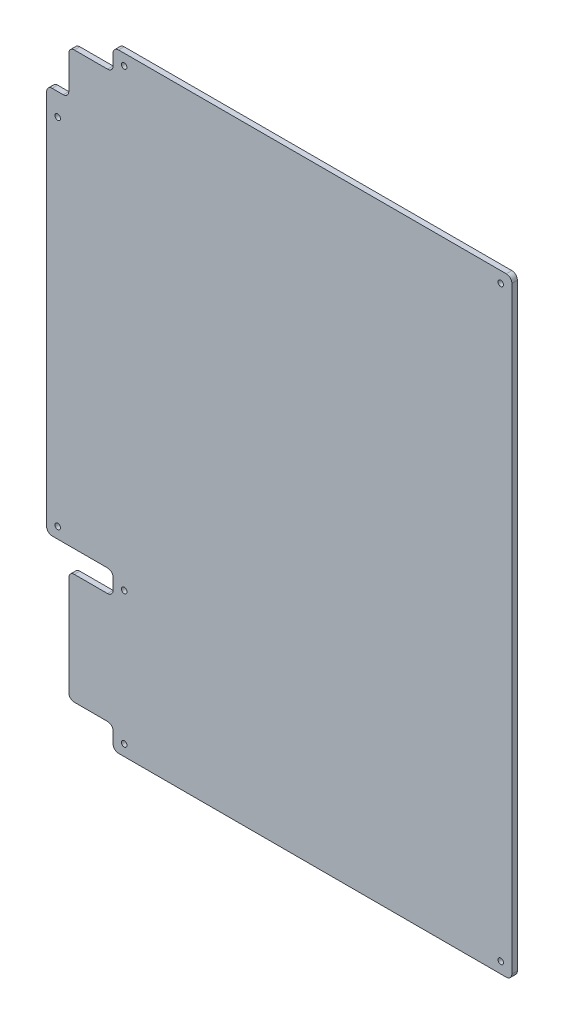
ISO-10303-21;
HEADER;
FILE_DESCRIPTION(('STEP AP214'),'2;1');
FILE_NAME('part.step','',(''),(''),'','','');
FILE_SCHEMA(('AUTOMOTIVE_DESIGN { 1 0 10303 214 1 1 1 1 }'));
ENDSEC;
DATA;
#1=APPLICATION_CONTEXT('core data for automotive mechanical design processes');
#2=APPLICATION_PROTOCOL_DEFINITION('international standard','automotive_design',2000,#1);
#3=PRODUCT_CONTEXT('',#1,'mechanical');
#4=PRODUCT('Part','Part','',(#3));
#5=PRODUCT_RELATED_PRODUCT_CATEGORY('part','',(#4));
#6=PRODUCT_DEFINITION_FORMATION('','',#4);
#7=PRODUCT_DEFINITION_CONTEXT('part definition',#1,'design');
#8=PRODUCT_DEFINITION('design','',#6,#7);
#9=PRODUCT_DEFINITION_SHAPE('','',#8);
#10=(LENGTH_UNIT() NAMED_UNIT(*) SI_UNIT(.MILLI.,.METRE.));
#11=(NAMED_UNIT(*) PLANE_ANGLE_UNIT() SI_UNIT($,.RADIAN.));
#12=(NAMED_UNIT(*) SI_UNIT($,.STERADIAN.) SOLID_ANGLE_UNIT());
#13=UNCERTAINTY_MEASURE_WITH_UNIT(LENGTH_MEASURE(1.E-05),#10,'distance_accuracy_value','');
#14=(GEOMETRIC_REPRESENTATION_CONTEXT(3) GLOBAL_UNCERTAINTY_ASSIGNED_CONTEXT((#13)) GLOBAL_UNIT_ASSIGNED_CONTEXT((#10,
#11,#12)) REPRESENTATION_CONTEXT('',''));
#15=CARTESIAN_POINT('',(0.,0.,0.));
#16=DIRECTION('',(0.,0.,1.));
#17=DIRECTION('',(1.,0.,0.));
#18=AXIS2_PLACEMENT_3D('',#15,#16,#17);
#19=CARTESIAN_POINT('',(210.,275.,5.));
#20=DIRECTION('',(-1.,0.,0.));
#21=DIRECTION('',(0.,0.,1.));
#22=AXIS2_PLACEMENT_3D('',#19,#20,#21);
#23=PLANE('',#22);
#24=DIRECTION('',(0.,1.,0.));
#25=VECTOR('',#24,1.);
#26=CARTESIAN_POINT('',(210.,275.,5.));
#27=LINE('',#26,#25);
#28=CARTESIAN_POINT('',(210.,-270.,5.));
#29=VERTEX_POINT('',#28);
#30=CARTESIAN_POINT('',(210.,270.,5.));
#31=VERTEX_POINT('',#30);
#32=EDGE_CURVE('E246',#29,#31,#27,.T.);
#33=ORIENTED_EDGE('',*,*,#32,.F.);
#34=DIRECTION('',(0.,0.,-1.));
#35=VECTOR('',#34,1.);
#36=CARTESIAN_POINT('',(210.,-270.,5.));
#37=LINE('',#36,#35);
#38=CARTESIAN_POINT('',(210.,-270.,0.));
#39=VERTEX_POINT('',#38);
#40=EDGE_CURVE('E230',#29,#39,#37,.T.);
#41=ORIENTED_EDGE('',*,*,#40,.T.);
#42=DIRECTION('',(0.,1.,0.));
#43=VECTOR('',#42,1.);
#44=CARTESIAN_POINT('',(210.,275.,0.));
#45=LINE('',#44,#43);
#46=CARTESIAN_POINT('',(210.,270.,0.));
#47=VERTEX_POINT('',#46);
#48=EDGE_CURVE('E243',#39,#47,#45,.T.);
#49=ORIENTED_EDGE('',*,*,#48,.T.);
#50=DIRECTION('',(0.,0.,-1.));
#51=VECTOR('',#50,1.);
#52=CARTESIAN_POINT('',(210.,270.,5.));
#53=LINE('',#52,#51);
#54=EDGE_CURVE('E249',#47,#31,#53,.F.);
#55=ORIENTED_EDGE('',*,*,#54,.T.);
#56=EDGE_LOOP('',(#33,#41,#49,#55));
#57=FACE_BOUND('',#56,.T.);
#58=ADVANCED_FACE('F39',(#57),#23,.F.);
#59=CARTESIAN_POINT('',(-210.,275.,5.));
#60=DIRECTION('',(0.,-1.,0.));
#61=DIRECTION('',(0.,0.,-1.));
#62=AXIS2_PLACEMENT_3D('',#59,#60,#61);
#63=PLANE('',#62);
#64=DIRECTION('',(-1.,0.,0.));
#65=VECTOR('',#64,1.);
#66=CARTESIAN_POINT('',(-210.,275.,5.));
#67=LINE('',#66,#65);
#68=CARTESIAN_POINT('',(205.,275.,5.));
#69=VERTEX_POINT('',#68);
#70=CARTESIAN_POINT('',(-145.,275.,5.));
#71=VERTEX_POINT('',#70);
#72=EDGE_CURVE('E532',#69,#71,#67,.T.);
#73=ORIENTED_EDGE('',*,*,#72,.F.);
#74=DIRECTION('',(0.,0.,-1.));
#75=VECTOR('',#74,1.);
#76=CARTESIAN_POINT('',(205.,275.,5.));
#77=LINE('',#76,#75);
#78=CARTESIAN_POINT('',(205.,275.,0.));
#79=VERTEX_POINT('',#78);
#80=EDGE_CURVE('E396',#69,#79,#77,.T.);
#81=ORIENTED_EDGE('',*,*,#80,.T.);
#82=DIRECTION('',(-1.,0.,0.));
#83=VECTOR('',#82,1.);
#84=CARTESIAN_POINT('',(-210.,275.,0.));
#85=LINE('',#84,#83);
#86=CARTESIAN_POINT('',(-145.,275.,0.));
#87=VERTEX_POINT('',#86);
#88=EDGE_CURVE('E254',#79,#87,#85,.T.);
#89=ORIENTED_EDGE('',*,*,#88,.T.);
#90=DIRECTION('',(0.,0.,1.));
#91=VECTOR('',#90,1.);
#92=CARTESIAN_POINT('',(-145.,275.,5.));
#93=LINE('',#92,#91);
#94=EDGE_CURVE('E392',#87,#71,#93,.T.);
#95=ORIENTED_EDGE('',*,*,#94,.T.);
#96=EDGE_LOOP('',(#73,#81,#89,#95));
#97=FACE_BOUND('',#96,.T.);
#98=ADVANCED_FACE('F529',(#97),#63,.F.);
#99=CARTESIAN_POINT('',(-210.,275.,5.));
#100=DIRECTION('',(1.,0.,0.));
#101=DIRECTION('',(0.,0.,-1.));
#102=AXIS2_PLACEMENT_3D('',#99,#100,#101);
#103=PLANE('',#102);
#104=DIRECTION('',(0.,-1.,0.));
#105=VECTOR('',#104,1.);
#106=CARTESIAN_POINT('',(-210.,275.,0.));
#107=LINE('',#106,#105);
#108=CARTESIAN_POINT('',(-210.,210.,0.));
#109=VERTEX_POINT('',#108);
#110=CARTESIAN_POINT('',(-210.,-130.,0.));
#111=VERTEX_POINT('',#110);
#112=EDGE_CURVE('E260',#109,#111,#107,.T.);
#113=ORIENTED_EDGE('',*,*,#112,.T.);
#114=DIRECTION('',(0.,0.,1.));
#115=VECTOR('',#114,1.);
#116=CARTESIAN_POINT('',(-210.,-130.,5.));
#117=LINE('',#116,#115);
#118=CARTESIAN_POINT('',(-210.,-130.,5.));
#119=VERTEX_POINT('',#118);
#120=EDGE_CURVE('E445',#111,#119,#117,.T.);
#121=ORIENTED_EDGE('',*,*,#120,.T.);
#122=DIRECTION('',(0.,-1.,0.));
#123=VECTOR('',#122,1.);
#124=CARTESIAN_POINT('',(-210.,275.,5.));
#125=LINE('',#124,#123);
#126=CARTESIAN_POINT('',(-210.,210.,5.));
#127=VERTEX_POINT('',#126);
#128=EDGE_CURVE('E539',#127,#119,#125,.T.);
#129=ORIENTED_EDGE('',*,*,#128,.F.);
#130=DIRECTION('',(0.,0.,1.));
#131=VECTOR('',#130,1.);
#132=CARTESIAN_POINT('',(-210.,210.,5.));
#133=LINE('',#132,#131);
#134=EDGE_CURVE('E442',#127,#109,#133,.F.);
#135=ORIENTED_EDGE('',*,*,#134,.T.);
#136=EDGE_LOOP('',(#113,#121,#129,#135));
#137=FACE_BOUND('',#136,.T.);
#138=ADVANCED_FACE('F618',(#137),#103,.F.);
#139=CARTESIAN_POINT('',(-210.,-275.,5.));
#140=DIRECTION('',(0.,1.,0.));
#141=DIRECTION('',(0.,0.,1.));
#142=AXIS2_PLACEMENT_3D('',#139,#140,#141);
#143=PLANE('',#142);
#144=DIRECTION('',(1.,0.,0.));
#145=VECTOR('',#144,1.);
#146=CARTESIAN_POINT('',(-210.,-275.,0.));
#147=LINE('',#146,#145);
#148=CARTESIAN_POINT('',(-145.,-275.,0.));
#149=VERTEX_POINT('',#148);
#150=CARTESIAN_POINT('',(205.,-275.,0.));
#151=VERTEX_POINT('',#150);
#152=EDGE_CURVE('E272',#149,#151,#147,.T.);
#153=ORIENTED_EDGE('',*,*,#152,.T.);
#154=DIRECTION('',(0.,0.,-1.));
#155=VECTOR('',#154,1.);
#156=CARTESIAN_POINT('',(205.,-275.,5.));
#157=LINE('',#156,#155);
#158=CARTESIAN_POINT('',(205.,-275.,5.));
#159=VERTEX_POINT('',#158);
#160=EDGE_CURVE('E231',#151,#159,#157,.F.);
#161=ORIENTED_EDGE('',*,*,#160,.T.);
#162=DIRECTION('',(1.,0.,0.));
#163=VECTOR('',#162,1.);
#164=CARTESIAN_POINT('',(-210.,-275.,5.));
#165=LINE('',#164,#163);
#166=CARTESIAN_POINT('',(-145.,-275.,5.));
#167=VERTEX_POINT('',#166);
#168=EDGE_CURVE('E266',#167,#159,#165,.T.);
#169=ORIENTED_EDGE('',*,*,#168,.F.);
#170=DIRECTION('',(0.,0.,1.));
#171=VECTOR('',#170,1.);
#172=CARTESIAN_POINT('',(-145.,-275.,5.));
#173=LINE('',#172,#171);
#174=EDGE_CURVE('E237',#167,#149,#173,.F.);
#175=ORIENTED_EDGE('',*,*,#174,.T.);
#176=EDGE_LOOP('',(#153,#161,#169,#175));
#177=FACE_BOUND('',#176,.T.);
#178=ADVANCED_FACE('F548',(#177),#143,.F.);
#179=CARTESIAN_POINT('',(0.,0.,5.));
#180=DIRECTION('',(0.,0.,1.));
#181=DIRECTION('',(1.,0.,0.));
#182=AXIS2_PLACEMENT_3D('',#179,#180,#181);
#183=PLANE('',#182);
#184=CARTESIAN_POINT('',(-140.,265.,5.));
#185=DIRECTION('',(0.,0.,1.));
#186=DIRECTION('',(1.,0.,0.));
#187=AXIS2_PLACEMENT_3D('',#184,#185,#186);
#188=CIRCLE('',#187,2.50000000000002);
#189=CARTESIAN_POINT('',(-137.5,265.,5.));
#190=VERTEX_POINT('',#189);
#191=EDGE_CURVE('E664',#190,#190,#188,.T.);
#192=ORIENTED_EDGE('',*,*,#191,.F.);
#193=EDGE_LOOP('',(#192));
#194=FACE_BOUND('',#193,.T.);
#195=CARTESIAN_POINT('',(-200.,195.,5.));
#196=DIRECTION('',(0.,0.,1.));
#197=DIRECTION('',(1.,0.,0.));
#198=AXIS2_PLACEMENT_3D('',#195,#196,#197);
#199=CIRCLE('',#198,2.50000000000002);
#200=CARTESIAN_POINT('',(-197.5,195.,5.));
#201=VERTEX_POINT('',#200);
#202=EDGE_CURVE('E651',#201,#201,#199,.T.);
#203=ORIENTED_EDGE('',*,*,#202,.F.);
#204=EDGE_LOOP('',(#203));
#205=FACE_BOUND('',#204,.T.);
#206=CARTESIAN_POINT('',(200.,265.,5.));
#207=DIRECTION('',(0.,0.,1.));
#208=DIRECTION('',(1.,0.,0.));
#209=AXIS2_PLACEMENT_3D('',#206,#207,#208);
#210=CIRCLE('',#209,2.5);
#211=CARTESIAN_POINT('',(202.5,265.,5.));
#212=VERTEX_POINT('',#211);
#213=EDGE_CURVE('E647',#212,#212,#210,.T.);
#214=ORIENTED_EDGE('',*,*,#213,.F.);
#215=EDGE_LOOP('',(#214));
#216=FACE_BOUND('',#215,.T.);
#217=ORIENTED_EDGE('',*,*,#168,.T.);
#218=CARTESIAN_POINT('',(205.,-270.,5.));
#219=DIRECTION('',(0.,0.,1.));
#220=DIRECTION('',(1.,0.,0.));
#221=AXIS2_PLACEMENT_3D('',#218,#219,#220);
#222=CIRCLE('',#221,5.);
#223=EDGE_CURVE('E389',#159,#29,#222,.T.);
#224=ORIENTED_EDGE('',*,*,#223,.T.);
#225=ORIENTED_EDGE('',*,*,#32,.T.);
#226=CARTESIAN_POINT('',(205.,270.,5.));
#227=DIRECTION('',(0.,0.,1.));
#228=DIRECTION('',(1.,0.,0.));
#229=AXIS2_PLACEMENT_3D('',#226,#227,#228);
#230=CIRCLE('',#229,5.);
#231=EDGE_CURVE('E386',#31,#69,#230,.T.);
#232=ORIENTED_EDGE('',*,*,#231,.T.);
#233=ORIENTED_EDGE('',*,*,#72,.T.);
#234=CARTESIAN_POINT('',(-145.,270.,5.));
#235=DIRECTION('',(0.,0.,1.));
#236=DIRECTION('',(1.,0.,0.));
#237=AXIS2_PLACEMENT_3D('',#234,#235,#236);
#238=CIRCLE('',#237,5.);
#239=CARTESIAN_POINT('',(-150.,270.,5.));
#240=VERTEX_POINT('',#239);
#241=EDGE_CURVE('E367',#71,#240,#238,.T.);
#242=ORIENTED_EDGE('',*,*,#241,.T.);
#243=DIRECTION('',(0.,1.,0.));
#244=VECTOR('',#243,1.);
#245=CARTESIAN_POINT('',(-150.,275.,5.));
#246=LINE('',#245,#244);
#247=CARTESIAN_POINT('',(-150.,260.,5.));
#248=VERTEX_POINT('',#247);
#249=EDGE_CURVE('E297',#248,#240,#246,.T.);
#250=ORIENTED_EDGE('',*,*,#249,.F.);
#251=CARTESIAN_POINT('',(-155.,260.,5.));
#252=DIRECTION('',(0.,0.,1.));
#253=DIRECTION('',(1.,0.,0.));
#254=AXIS2_PLACEMENT_3D('',#251,#252,#253);
#255=CIRCLE('',#254,5.);
#256=CARTESIAN_POINT('',(-155.,255.,5.));
#257=VERTEX_POINT('',#256);
#258=EDGE_CURVE('E48',#248,#257,#255,.F.);
#259=ORIENTED_EDGE('',*,*,#258,.T.);
#260=DIRECTION('',(1.,0.,0.));
#261=VECTOR('',#260,1.);
#262=CARTESIAN_POINT('',(-150.,255.,5.));
#263=LINE('',#262,#261);
#264=CARTESIAN_POINT('',(-185.,255.,5.));
#265=VERTEX_POINT('',#264);
#266=EDGE_CURVE('E506',#265,#257,#263,.T.);
#267=ORIENTED_EDGE('',*,*,#266,.F.);
#268=CARTESIAN_POINT('',(-185.,250.,5.));
#269=DIRECTION('',(0.,0.,1.));
#270=DIRECTION('',(1.,0.,0.));
#271=AXIS2_PLACEMENT_3D('',#268,#269,#270);
#272=CIRCLE('',#271,5.);
#273=CARTESIAN_POINT('',(-190.,250.,5.));
#274=VERTEX_POINT('',#273);
#275=EDGE_CURVE('E370',#265,#274,#272,.T.);
#276=ORIENTED_EDGE('',*,*,#275,.T.);
#277=DIRECTION('',(0.,1.,0.));
#278=VECTOR('',#277,1.);
#279=CARTESIAN_POINT('',(-190.,255.,5.));
#280=LINE('',#279,#278);
#281=CARTESIAN_POINT('',(-190.,220.,5.));
#282=VERTEX_POINT('',#281);
#283=EDGE_CURVE('E516',#282,#274,#280,.T.);
#284=ORIENTED_EDGE('',*,*,#283,.F.);
#285=CARTESIAN_POINT('',(-195.,220.,5.));
#286=DIRECTION('',(0.,0.,1.));
#287=DIRECTION('',(1.,0.,0.));
#288=AXIS2_PLACEMENT_3D('',#285,#286,#287);
#289=CIRCLE('',#288,5.);
#290=CARTESIAN_POINT('',(-195.,215.,5.));
#291=VERTEX_POINT('',#290);
#292=EDGE_CURVE('E494',#282,#291,#289,.F.);
#293=ORIENTED_EDGE('',*,*,#292,.T.);
#294=DIRECTION('',(1.,0.,0.));
#295=VECTOR('',#294,1.);
#296=CARTESIAN_POINT('',(-190.,215.,5.));
#297=LINE('',#296,#295);
#298=CARTESIAN_POINT('',(-205.,215.,5.));
#299=VERTEX_POINT('',#298);
#300=EDGE_CURVE('E629',#299,#291,#297,.T.);
#301=ORIENTED_EDGE('',*,*,#300,.F.);
#302=CARTESIAN_POINT('',(-205.,210.,5.));
#303=DIRECTION('',(0.,0.,1.));
#304=DIRECTION('',(1.,0.,0.));
#305=AXIS2_PLACEMENT_3D('',#302,#303,#304);
#306=CIRCLE('',#305,5.);
#307=EDGE_CURVE('E63',#299,#127,#306,.T.);
#308=ORIENTED_EDGE('',*,*,#307,.T.);
#309=ORIENTED_EDGE('',*,*,#128,.T.);
#310=CARTESIAN_POINT('',(-205.,-130.,5.));
#311=DIRECTION('',(0.,0.,1.));
#312=DIRECTION('',(1.,0.,0.));
#313=AXIS2_PLACEMENT_3D('',#310,#311,#312);
#314=CIRCLE('',#313,5.);
#315=CARTESIAN_POINT('',(-205.,-135.,5.));
#316=VERTEX_POINT('',#315);
#317=EDGE_CURVE('E55',#119,#316,#314,.T.);
#318=ORIENTED_EDGE('',*,*,#317,.T.);
#319=DIRECTION('',(-1.,0.,0.));
#320=VECTOR('',#319,1.);
#321=CARTESIAN_POINT('',(-210.,-135.,5.));
#322=LINE('',#321,#320);
#323=CARTESIAN_POINT('',(-155.,-135.,5.));
#324=VERTEX_POINT('',#323);
#325=EDGE_CURVE('E613',#324,#316,#322,.T.);
#326=ORIENTED_EDGE('',*,*,#325,.F.);
#327=CARTESIAN_POINT('',(-155.,-140.,5.));
#328=DIRECTION('',(0.,0.,1.));
#329=DIRECTION('',(1.,0.,0.));
#330=AXIS2_PLACEMENT_3D('',#327,#328,#329);
#331=CIRCLE('',#330,5.);
#332=CARTESIAN_POINT('',(-150.,-140.,5.));
#333=VERTEX_POINT('',#332);
#334=EDGE_CURVE('E488',#324,#333,#331,.F.);
#335=ORIENTED_EDGE('',*,*,#334,.T.);
#336=DIRECTION('',(0.,1.,0.));
#337=VECTOR('',#336,1.);
#338=CARTESIAN_POINT('',(-150.,-135.,5.));
#339=LINE('',#338,#337);
#340=CARTESIAN_POINT('',(-150.,-150.,5.));
#341=VERTEX_POINT('',#340);
#342=EDGE_CURVE('E603',#341,#333,#339,.T.);
#343=ORIENTED_EDGE('',*,*,#342,.F.);
#344=CARTESIAN_POINT('',(-155.,-150.,5.));
#345=DIRECTION('',(0.,0.,1.));
#346=DIRECTION('',(1.,0.,0.));
#347=AXIS2_PLACEMENT_3D('',#344,#345,#346);
#348=CIRCLE('',#347,5.);
#349=CARTESIAN_POINT('',(-155.,-155.,5.));
#350=VERTEX_POINT('',#349);
#351=EDGE_CURVE('E482',#341,#350,#348,.F.);
#352=ORIENTED_EDGE('',*,*,#351,.T.);
#353=DIRECTION('',(1.,0.,0.));
#354=VECTOR('',#353,1.);
#355=CARTESIAN_POINT('',(-150.,-155.,5.));
#356=LINE('',#355,#354);
#357=CARTESIAN_POINT('',(-185.,-155.,5.));
#358=VERTEX_POINT('',#357);
#359=EDGE_CURVE('E592',#358,#350,#356,.T.);
#360=ORIENTED_EDGE('',*,*,#359,.F.);
#361=CARTESIAN_POINT('',(-185.,-160.,5.));
#362=DIRECTION('',(0.,0.,1.));
#363=DIRECTION('',(1.,0.,0.));
#364=AXIS2_PLACEMENT_3D('',#361,#362,#363);
#365=CIRCLE('',#364,5.);
#366=CARTESIAN_POINT('',(-190.,-160.,5.));
#367=VERTEX_POINT('',#366);
#368=EDGE_CURVE('E377',#358,#367,#365,.T.);
#369=ORIENTED_EDGE('',*,*,#368,.T.);
#370=DIRECTION('',(0.,1.,0.));
#371=VECTOR('',#370,1.);
#372=CARTESIAN_POINT('',(-190.,-155.,5.));
#373=LINE('',#372,#371);
#374=CARTESIAN_POINT('',(-190.,-250.,5.));
#375=VERTEX_POINT('',#374);
#376=EDGE_CURVE('E581',#375,#367,#373,.T.);
#377=ORIENTED_EDGE('',*,*,#376,.F.);
#378=CARTESIAN_POINT('',(-185.,-250.,5.));
#379=DIRECTION('',(0.,0.,1.));
#380=DIRECTION('',(1.,0.,0.));
#381=AXIS2_PLACEMENT_3D('',#378,#379,#380);
#382=CIRCLE('',#381,5.);
#383=CARTESIAN_POINT('',(-185.,-255.,5.));
#384=VERTEX_POINT('',#383);
#385=EDGE_CURVE('E380',#375,#384,#382,.T.);
#386=ORIENTED_EDGE('',*,*,#385,.T.);
#387=DIRECTION('',(-1.,0.,0.));
#388=VECTOR('',#387,1.);
#389=CARTESIAN_POINT('',(-190.,-255.,5.));
#390=LINE('',#389,#388);
#391=CARTESIAN_POINT('',(-155.,-255.,5.));
#392=VERTEX_POINT('',#391);
#393=EDGE_CURVE('E570',#392,#384,#390,.T.);
#394=ORIENTED_EDGE('',*,*,#393,.F.);
#395=CARTESIAN_POINT('',(-155.,-260.,5.));
#396=DIRECTION('',(0.,0.,1.));
#397=DIRECTION('',(1.,0.,0.));
#398=AXIS2_PLACEMENT_3D('',#395,#396,#397);
#399=CIRCLE('',#398,5.);
#400=CARTESIAN_POINT('',(-150.,-260.,5.));
#401=VERTEX_POINT('',#400);
#402=EDGE_CURVE('E476',#392,#401,#399,.F.);
#403=ORIENTED_EDGE('',*,*,#402,.T.);
#404=DIRECTION('',(0.,1.,0.));
#405=VECTOR('',#404,1.);
#406=CARTESIAN_POINT('',(-150.,-255.,5.));
#407=LINE('',#406,#405);
#408=CARTESIAN_POINT('',(-150.,-270.,5.));
#409=VERTEX_POINT('',#408);
#410=EDGE_CURVE('E559',#409,#401,#407,.T.);
#411=ORIENTED_EDGE('',*,*,#410,.F.);
#412=CARTESIAN_POINT('',(-145.,-270.,5.));
#413=DIRECTION('',(0.,0.,1.));
#414=DIRECTION('',(1.,0.,0.));
#415=AXIS2_PLACEMENT_3D('',#412,#413,#414);
#416=CIRCLE('',#415,5.);
#417=EDGE_CURVE('E383',#409,#167,#416,.T.);
#418=ORIENTED_EDGE('',*,*,#417,.T.);
#419=EDGE_LOOP('',(#217,#224,#225,#232,#233,#242,#250,#259,#267,#276,#284,#293,#301,#308,#309,
#318,#326,#335,#343,#352,#360,#369,#377,#386,#394,#403,#411,#418));
#420=FACE_BOUND('',#419,.T.);
#421=CARTESIAN_POINT('',(-200.,-125.,5.));
#422=DIRECTION('',(0.,0.,1.));
#423=DIRECTION('',(1.,0.,0.));
#424=AXIS2_PLACEMENT_3D('',#421,#422,#423);
#425=CIRCLE('',#424,2.50000000000002);
#426=CARTESIAN_POINT('',(-197.5,-125.,5.));
#427=VERTEX_POINT('',#426);
#428=EDGE_CURVE('E680',#427,#427,#425,.T.);
#429=ORIENTED_EDGE('',*,*,#428,.F.);
#430=EDGE_LOOP('',(#429));
#431=FACE_BOUND('',#430,.T.);
#432=CARTESIAN_POINT('',(-140.,-265.,5.));
#433=DIRECTION('',(0.,0.,1.));
#434=DIRECTION('',(-1.,0.,0.));
#435=AXIS2_PLACEMENT_3D('',#432,#433,#434);
#436=CIRCLE('',#435,2.50000000000002);
#437=CARTESIAN_POINT('',(-142.5,-265.,5.));
#438=VERTEX_POINT('',#437);
#439=EDGE_CURVE('E676',#438,#438,#436,.T.);
#440=ORIENTED_EDGE('',*,*,#439,.F.);
#441=EDGE_LOOP('',(#440));
#442=FACE_BOUND('',#441,.T.);
#443=CARTESIAN_POINT('',(-140.,-145.,5.));
#444=DIRECTION('',(0.,0.,1.));
#445=DIRECTION('',(1.,0.,0.));
#446=AXIS2_PLACEMENT_3D('',#443,#444,#445);
#447=CIRCLE('',#446,2.50000000000002);
#448=CARTESIAN_POINT('',(-137.5,-145.,5.));
#449=VERTEX_POINT('',#448);
#450=EDGE_CURVE('E672',#449,#449,#447,.T.);
#451=ORIENTED_EDGE('',*,*,#450,.F.);
#452=EDGE_LOOP('',(#451));
#453=FACE_BOUND('',#452,.T.);
#454=CARTESIAN_POINT('',(200.,-265.,5.));
#455=DIRECTION('',(0.,0.,1.));
#456=DIRECTION('',(1.,0.,0.));
#457=AXIS2_PLACEMENT_3D('',#454,#455,#456);
#458=CIRCLE('',#457,2.5);
#459=CARTESIAN_POINT('',(202.5,-265.,5.));
#460=VERTEX_POINT('',#459);
#461=EDGE_CURVE('E668',#460,#460,#458,.T.);
#462=ORIENTED_EDGE('',*,*,#461,.F.);
#463=EDGE_LOOP('',(#462));
#464=FACE_BOUND('',#463,.T.);
#465=ADVANCED_FACE('F504',(#194,#205,#216,#420,#431,#442,#453,#464),#183,.T.);
#466=CARTESIAN_POINT('',(0.,0.,0.));
#467=DIRECTION('',(0.,0.,1.));
#468=DIRECTION('',(1.,0.,0.));
#469=AXIS2_PLACEMENT_3D('',#466,#467,#468);
#470=PLANE('',#469);
#471=CARTESIAN_POINT('',(-140.,265.,0.));
#472=DIRECTION('',(0.,0.,1.));
#473=DIRECTION('',(1.,0.,0.));
#474=AXIS2_PLACEMENT_3D('',#471,#472,#473);
#475=CIRCLE('',#474,2.50000000000002);
#476=CARTESIAN_POINT('',(-137.5,265.,0.));
#477=VERTEX_POINT('',#476);
#478=EDGE_CURVE('E255',#477,#477,#475,.T.);
#479=ORIENTED_EDGE('',*,*,#478,.T.);
#480=EDGE_LOOP('',(#479));
#481=FACE_BOUND('',#480,.T.);
#482=CARTESIAN_POINT('',(-200.,195.,0.));
#483=DIRECTION('',(0.,0.,1.));
#484=DIRECTION('',(1.,0.,0.));
#485=AXIS2_PLACEMENT_3D('',#482,#483,#484);
#486=CIRCLE('',#485,2.50000000000002);
#487=CARTESIAN_POINT('',(-197.5,195.,0.));
#488=VERTEX_POINT('',#487);
#489=EDGE_CURVE('E263',#488,#488,#486,.T.);
#490=ORIENTED_EDGE('',*,*,#489,.T.);
#491=EDGE_LOOP('',(#490));
#492=FACE_BOUND('',#491,.T.);
#493=CARTESIAN_POINT('',(200.,265.,0.));
#494=DIRECTION('',(0.,0.,1.));
#495=DIRECTION('',(1.,0.,0.));
#496=AXIS2_PLACEMENT_3D('',#493,#494,#495);
#497=CIRCLE('',#496,2.5);
#498=CARTESIAN_POINT('',(202.5,265.,0.));
#499=VERTEX_POINT('',#498);
#500=EDGE_CURVE('E309',#499,#499,#497,.T.);
#501=ORIENTED_EDGE('',*,*,#500,.T.);
#502=EDGE_LOOP('',(#501));
#503=FACE_BOUND('',#502,.T.);
#504=CARTESIAN_POINT('',(-200.,-125.,0.));
#505=DIRECTION('',(0.,0.,1.));
#506=DIRECTION('',(1.,0.,0.));
#507=AXIS2_PLACEMENT_3D('',#504,#505,#506);
#508=CIRCLE('',#507,2.50000000000002);
#509=CARTESIAN_POINT('',(-197.5,-125.,0.));
#510=VERTEX_POINT('',#509);
#511=EDGE_CURVE('E305',#510,#510,#508,.T.);
#512=ORIENTED_EDGE('',*,*,#511,.T.);
#513=EDGE_LOOP('',(#512));
#514=FACE_BOUND('',#513,.T.);
#515=CARTESIAN_POINT('',(-140.,-265.,0.));
#516=DIRECTION('',(0.,0.,1.));
#517=DIRECTION('',(1.,0.,0.));
#518=AXIS2_PLACEMENT_3D('',#515,#516,#517);
#519=CIRCLE('',#518,2.50000000000002);
#520=CARTESIAN_POINT('',(-137.5,-265.,0.));
#521=VERTEX_POINT('',#520);
#522=EDGE_CURVE('E301',#521,#521,#519,.T.);
#523=ORIENTED_EDGE('',*,*,#522,.T.);
#524=EDGE_LOOP('',(#523));
#525=FACE_BOUND('',#524,.T.);
#526=CARTESIAN_POINT('',(-140.,-145.,0.));
#527=DIRECTION('',(0.,0.,1.));
#528=DIRECTION('',(1.,0.,0.));
#529=AXIS2_PLACEMENT_3D('',#526,#527,#528);
#530=CIRCLE('',#529,2.50000000000002);
#531=CARTESIAN_POINT('',(-137.5,-145.,0.));
#532=VERTEX_POINT('',#531);
#533=EDGE_CURVE('E296',#532,#532,#530,.T.);
#534=ORIENTED_EDGE('',*,*,#533,.T.);
#535=EDGE_LOOP('',(#534));
#536=FACE_BOUND('',#535,.T.);
#537=CARTESIAN_POINT('',(200.,-265.,0.));
#538=DIRECTION('',(0.,0.,1.));
#539=DIRECTION('',(1.,0.,0.));
#540=AXIS2_PLACEMENT_3D('',#537,#538,#539);
#541=CIRCLE('',#540,2.5);
#542=CARTESIAN_POINT('',(202.5,-265.,0.));
#543=VERTEX_POINT('',#542);
#544=EDGE_CURVE('E292',#543,#543,#541,.T.);
#545=ORIENTED_EDGE('',*,*,#544,.T.);
#546=EDGE_LOOP('',(#545));
#547=FACE_BOUND('',#546,.T.);
#548=ORIENTED_EDGE('',*,*,#48,.F.);
#549=CARTESIAN_POINT('',(205.,-270.,0.));
#550=DIRECTION('',(0.,0.,1.));
#551=DIRECTION('',(1.,0.,0.));
#552=AXIS2_PLACEMENT_3D('',#549,#550,#551);
#553=CIRCLE('',#552,5.);
#554=EDGE_CURVE('E226',#39,#151,#553,.F.);
#555=ORIENTED_EDGE('',*,*,#554,.T.);
#556=ORIENTED_EDGE('',*,*,#152,.F.);
#557=CARTESIAN_POINT('',(-145.,-270.,0.));
#558=DIRECTION('',(0.,0.,1.));
#559=DIRECTION('',(1.,0.,0.));
#560=AXIS2_PLACEMENT_3D('',#557,#558,#559);
#561=CIRCLE('',#560,5.);
#562=CARTESIAN_POINT('',(-150.,-270.,0.));
#563=VERTEX_POINT('',#562);
#564=EDGE_CURVE('E358',#149,#563,#561,.F.);
#565=ORIENTED_EDGE('',*,*,#564,.T.);
#566=DIRECTION('',(0.,1.,0.));
#567=VECTOR('',#566,1.);
#568=CARTESIAN_POINT('',(-150.,0.,0.));
#569=LINE('',#568,#567);
#570=CARTESIAN_POINT('',(-150.,-260.,0.));
#571=VERTEX_POINT('',#570);
#572=EDGE_CURVE('E291',#563,#571,#569,.T.);
#573=ORIENTED_EDGE('',*,*,#572,.T.);
#574=CARTESIAN_POINT('',(-155.,-260.,0.));
#575=DIRECTION('',(0.,0.,1.));
#576=DIRECTION('',(1.,0.,0.));
#577=AXIS2_PLACEMENT_3D('',#574,#575,#576);
#578=CIRCLE('',#577,5.);
#579=CARTESIAN_POINT('',(-155.,-255.,0.));
#580=VERTEX_POINT('',#579);
#581=EDGE_CURVE('E479',#571,#580,#578,.T.);
#582=ORIENTED_EDGE('',*,*,#581,.T.);
#583=DIRECTION('',(-1.,0.,0.));
#584=VECTOR('',#583,1.);
#585=CARTESIAN_POINT('',(0.,-255.,0.));
#586=LINE('',#585,#584);
#587=CARTESIAN_POINT('',(-185.,-255.,0.));
#588=VERTEX_POINT('',#587);
#589=EDGE_CURVE('E313',#580,#588,#586,.T.);
#590=ORIENTED_EDGE('',*,*,#589,.T.);
#591=CARTESIAN_POINT('',(-185.,-250.,0.));
#592=DIRECTION('',(0.,0.,1.));
#593=DIRECTION('',(1.,0.,0.));
#594=AXIS2_PLACEMENT_3D('',#591,#592,#593);
#595=CIRCLE('',#594,5.);
#596=CARTESIAN_POINT('',(-190.,-250.,0.));
#597=VERTEX_POINT('',#596);
#598=EDGE_CURVE('E355',#588,#597,#595,.F.);
#599=ORIENTED_EDGE('',*,*,#598,.T.);
#600=DIRECTION('',(0.,1.,0.));
#601=VECTOR('',#600,1.);
#602=CARTESIAN_POINT('',(-190.,0.,0.));
#603=LINE('',#602,#601);
#604=CARTESIAN_POINT('',(-190.,-160.,0.));
#605=VERTEX_POINT('',#604);
#606=EDGE_CURVE('E317',#597,#605,#603,.T.);
#607=ORIENTED_EDGE('',*,*,#606,.T.);
#608=CARTESIAN_POINT('',(-185.,-160.,0.));
#609=DIRECTION('',(0.,0.,1.));
#610=DIRECTION('',(1.,0.,0.));
#611=AXIS2_PLACEMENT_3D('',#608,#609,#610);
#612=CIRCLE('',#611,5.);
#613=CARTESIAN_POINT('',(-185.,-155.,0.));
#614=VERTEX_POINT('',#613);
#615=EDGE_CURVE('E352',#605,#614,#612,.F.);
#616=ORIENTED_EDGE('',*,*,#615,.T.);
#617=DIRECTION('',(1.,0.,0.));
#618=VECTOR('',#617,1.);
#619=CARTESIAN_POINT('',(1.07552855510562E-13,-155.,0.));
#620=LINE('',#619,#618);
#621=CARTESIAN_POINT('',(-155.,-155.,0.));
#622=VERTEX_POINT('',#621);
#623=EDGE_CURVE('E321',#614,#622,#620,.T.);
#624=ORIENTED_EDGE('',*,*,#623,.T.);
#625=CARTESIAN_POINT('',(-155.,-150.,0.));
#626=DIRECTION('',(0.,0.,1.));
#627=DIRECTION('',(1.,0.,0.));
#628=AXIS2_PLACEMENT_3D('',#625,#626,#627);
#629=CIRCLE('',#628,5.);
#630=CARTESIAN_POINT('',(-150.,-150.,0.));
#631=VERTEX_POINT('',#630);
#632=EDGE_CURVE('E485',#622,#631,#629,.T.);
#633=ORIENTED_EDGE('',*,*,#632,.T.);
#634=DIRECTION('',(0.,1.,0.));
#635=VECTOR('',#634,1.);
#636=CARTESIAN_POINT('',(-150.,2.08166817117217E-13,0.));
#637=LINE('',#636,#635);
#638=CARTESIAN_POINT('',(-150.,-140.,0.));
#639=VERTEX_POINT('',#638);
#640=EDGE_CURVE('E325',#631,#639,#637,.T.);
#641=ORIENTED_EDGE('',*,*,#640,.T.);
#642=CARTESIAN_POINT('',(-155.,-140.,0.));
#643=DIRECTION('',(0.,0.,1.));
#644=DIRECTION('',(1.,0.,0.));
#645=AXIS2_PLACEMENT_3D('',#642,#643,#644);
#646=CIRCLE('',#645,5.);
#647=CARTESIAN_POINT('',(-155.,-135.,0.));
#648=VERTEX_POINT('',#647);
#649=EDGE_CURVE('E491',#639,#648,#646,.T.);
#650=ORIENTED_EDGE('',*,*,#649,.T.);
#651=DIRECTION('',(-1.,0.,0.));
#652=VECTOR('',#651,1.);
#653=CARTESIAN_POINT('',(0.,-135.,0.));
#654=LINE('',#653,#652);
#655=CARTESIAN_POINT('',(-205.,-135.,0.));
#656=VERTEX_POINT('',#655);
#657=EDGE_CURVE('E329',#648,#656,#654,.T.);
#658=ORIENTED_EDGE('',*,*,#657,.T.);
#659=CARTESIAN_POINT('',(-205.,-130.,0.));
#660=DIRECTION('',(0.,0.,1.));
#661=DIRECTION('',(1.,0.,0.));
#662=AXIS2_PLACEMENT_3D('',#659,#660,#661);
#663=CIRCLE('',#662,5.);
#664=EDGE_CURVE('E349',#656,#111,#663,.F.);
#665=ORIENTED_EDGE('',*,*,#664,.T.);
#666=ORIENTED_EDGE('',*,*,#112,.F.);
#667=CARTESIAN_POINT('',(-205.,210.,0.));
#668=DIRECTION('',(0.,0.,1.));
#669=DIRECTION('',(1.,0.,0.));
#670=AXIS2_PLACEMENT_3D('',#667,#668,#669);
#671=CIRCLE('',#670,5.);
#672=CARTESIAN_POINT('',(-205.,215.,0.));
#673=VERTEX_POINT('',#672);
#674=EDGE_CURVE('E346',#109,#673,#671,.F.);
#675=ORIENTED_EDGE('',*,*,#674,.T.);
#676=DIRECTION('',(1.,0.,0.));
#677=VECTOR('',#676,1.);
#678=CARTESIAN_POINT('',(0.,215.,0.));
#679=LINE('',#678,#677);
#680=CARTESIAN_POINT('',(-195.,215.,0.));
#681=VERTEX_POINT('',#680);
#682=EDGE_CURVE('E275',#673,#681,#679,.T.);
#683=ORIENTED_EDGE('',*,*,#682,.T.);
#684=CARTESIAN_POINT('',(-195.,220.,0.));
#685=DIRECTION('',(0.,0.,1.));
#686=DIRECTION('',(1.,0.,0.));
#687=AXIS2_PLACEMENT_3D('',#684,#685,#686);
#688=CIRCLE('',#687,5.);
#689=CARTESIAN_POINT('',(-190.,220.,0.));
#690=VERTEX_POINT('',#689);
#691=EDGE_CURVE('E497',#681,#690,#688,.T.);
#692=ORIENTED_EDGE('',*,*,#691,.T.);
#693=DIRECTION('',(0.,1.,0.));
#694=VECTOR('',#693,1.);
#695=CARTESIAN_POINT('',(-190.,-1.31838984174237E-13,0.));
#696=LINE('',#695,#694);
#697=CARTESIAN_POINT('',(-190.,250.,0.));
#698=VERTEX_POINT('',#697);
#699=EDGE_CURVE('E279',#690,#698,#696,.T.);
#700=ORIENTED_EDGE('',*,*,#699,.T.);
#701=CARTESIAN_POINT('',(-185.,250.,0.));
#702=DIRECTION('',(0.,0.,1.));
#703=DIRECTION('',(1.,0.,0.));
#704=AXIS2_PLACEMENT_3D('',#701,#702,#703);
#705=CIRCLE('',#704,5.);
#706=CARTESIAN_POINT('',(-185.,255.,0.));
#707=VERTEX_POINT('',#706);
#708=EDGE_CURVE('E343',#698,#707,#705,.F.);
#709=ORIENTED_EDGE('',*,*,#708,.T.);
#710=DIRECTION('',(1.,0.,0.));
#711=VECTOR('',#710,1.);
#712=CARTESIAN_POINT('',(3.53883589099268E-13,255.,0.));
#713=LINE('',#712,#711);
#714=CARTESIAN_POINT('',(-155.,255.,0.));
#715=VERTEX_POINT('',#714);
#716=EDGE_CURVE('E283',#707,#715,#713,.T.);
#717=ORIENTED_EDGE('',*,*,#716,.T.);
#718=CARTESIAN_POINT('',(-155.,260.,0.));
#719=DIRECTION('',(0.,0.,1.));
#720=DIRECTION('',(1.,0.,0.));
#721=AXIS2_PLACEMENT_3D('',#718,#719,#720);
#722=CIRCLE('',#721,5.);
#723=CARTESIAN_POINT('',(-150.,260.,0.));
#724=VERTEX_POINT('',#723);
#725=EDGE_CURVE('E11',#715,#724,#722,.T.);
#726=ORIENTED_EDGE('',*,*,#725,.T.);
#727=DIRECTION('',(0.,1.,0.));
#728=VECTOR('',#727,1.);
#729=CARTESIAN_POINT('',(-150.,-2.08166817117216E-13,0.));
#730=LINE('',#729,#728);
#731=CARTESIAN_POINT('',(-150.,270.,0.));
#732=VERTEX_POINT('',#731);
#733=EDGE_CURVE('E287',#724,#732,#730,.T.);
#734=ORIENTED_EDGE('',*,*,#733,.T.);
#735=CARTESIAN_POINT('',(-145.,270.,0.));
#736=DIRECTION('',(0.,0.,1.));
#737=DIRECTION('',(1.,0.,0.));
#738=AXIS2_PLACEMENT_3D('',#735,#736,#737);
#739=CIRCLE('',#738,5.);
#740=EDGE_CURVE('E248',#732,#87,#739,.F.);
#741=ORIENTED_EDGE('',*,*,#740,.T.);
#742=ORIENTED_EDGE('',*,*,#88,.F.);
#743=CARTESIAN_POINT('',(205.,270.,0.));
#744=DIRECTION('',(0.,0.,1.));
#745=DIRECTION('',(1.,0.,0.));
#746=AXIS2_PLACEMENT_3D('',#743,#744,#745);
#747=CIRCLE('',#746,5.);
#748=EDGE_CURVE('E238',#79,#47,#747,.F.);
#749=ORIENTED_EDGE('',*,*,#748,.T.);
#750=EDGE_LOOP('',(#548,#555,#556,#565,#573,#582,#590,#599,#607,#616,#624,#633,#641,#650,#658,
#665,#666,#675,#683,#692,#700,#709,#717,#726,#734,#741,#742,#749));
#751=FACE_BOUND('',#750,.T.);
#752=ADVANCED_FACE('F251',(#481,#492,#503,#514,#525,#536,#547,#751),#470,.F.);
#753=CARTESIAN_POINT('',(-150.,275.,-10.));
#754=DIRECTION('',(1.,0.,0.));
#755=DIRECTION('',(0.,1.,0.));
#756=AXIS2_PLACEMENT_3D('',#753,#754,#755);
#757=PLANE('',#756);
#758=ORIENTED_EDGE('',*,*,#733,.F.);
#759=DIRECTION('',(0.,0.,1.));
#760=VECTOR('',#759,1.);
#761=CARTESIAN_POINT('',(-150.,260.,5.));
#762=LINE('',#761,#760);
#763=EDGE_CURVE('E472',#724,#248,#762,.T.);
#764=ORIENTED_EDGE('',*,*,#763,.T.);
#765=ORIENTED_EDGE('',*,*,#249,.T.);
#766=DIRECTION('',(0.,0.,1.));
#767=VECTOR('',#766,1.);
#768=CARTESIAN_POINT('',(-150.,270.,-10.));
#769=LINE('',#768,#767);
#770=EDGE_CURVE('E469',#240,#732,#769,.F.);
#771=ORIENTED_EDGE('',*,*,#770,.T.);
#772=EDGE_LOOP('',(#758,#764,#765,#771));
#773=FACE_BOUND('',#772,.T.);
#774=ADVANCED_FACE('F523',(#773),#757,.F.);
#775=CARTESIAN_POINT('',(-150.,255.,-10.));
#776=DIRECTION('',(0.,-1.,0.));
#777=DIRECTION('',(1.,0.,0.));
#778=AXIS2_PLACEMENT_3D('',#775,#776,#777);
#779=PLANE('',#778);
#780=ORIENTED_EDGE('',*,*,#716,.F.);
#781=DIRECTION('',(0.,0.,1.));
#782=VECTOR('',#781,1.);
#783=CARTESIAN_POINT('',(-185.,255.,-10.));
#784=LINE('',#783,#782);
#785=EDGE_CURVE('E465',#707,#265,#784,.T.);
#786=ORIENTED_EDGE('',*,*,#785,.T.);
#787=ORIENTED_EDGE('',*,*,#266,.T.);
#788=DIRECTION('',(0.,0.,1.));
#789=VECTOR('',#788,1.);
#790=CARTESIAN_POINT('',(-155.,255.,0.));
#791=LINE('',#790,#789);
#792=EDGE_CURVE('E462',#257,#715,#791,.F.);
#793=ORIENTED_EDGE('',*,*,#792,.T.);
#794=EDGE_LOOP('',(#780,#786,#787,#793));
#795=FACE_BOUND('',#794,.T.);
#796=ADVANCED_FACE('F513',(#795),#779,.F.);
#797=CARTESIAN_POINT('',(-190.,255.,-10.));
#798=DIRECTION('',(1.,0.,0.));
#799=DIRECTION('',(0.,1.,0.));
#800=AXIS2_PLACEMENT_3D('',#797,#798,#799);
#801=PLANE('',#800);
#802=ORIENTED_EDGE('',*,*,#699,.F.);
#803=DIRECTION('',(0.,0.,1.));
#804=VECTOR('',#803,1.);
#805=CARTESIAN_POINT('',(-190.,220.,5.));
#806=LINE('',#805,#804);
#807=EDGE_CURVE('E458',#690,#282,#806,.T.);
#808=ORIENTED_EDGE('',*,*,#807,.T.);
#809=ORIENTED_EDGE('',*,*,#283,.T.);
#810=DIRECTION('',(0.,0.,1.));
#811=VECTOR('',#810,1.);
#812=CARTESIAN_POINT('',(-190.,250.,-10.));
#813=LINE('',#812,#811);
#814=EDGE_CURVE('E455',#274,#698,#813,.F.);
#815=ORIENTED_EDGE('',*,*,#814,.T.);
#816=EDGE_LOOP('',(#802,#808,#809,#815));
#817=FACE_BOUND('',#816,.T.);
#818=ADVANCED_FACE('F636',(#817),#801,.F.);
#819=CARTESIAN_POINT('',(-190.,215.,-10.));
#820=DIRECTION('',(0.,-1.,0.));
#821=DIRECTION('',(0.,0.,-1.));
#822=AXIS2_PLACEMENT_3D('',#819,#820,#821);
#823=PLANE('',#822);
#824=ORIENTED_EDGE('',*,*,#682,.F.);
#825=DIRECTION('',(0.,0.,1.));
#826=VECTOR('',#825,1.);
#827=CARTESIAN_POINT('',(-205.,215.,-10.));
#828=LINE('',#827,#826);
#829=EDGE_CURVE('E451',#673,#299,#828,.T.);
#830=ORIENTED_EDGE('',*,*,#829,.T.);
#831=ORIENTED_EDGE('',*,*,#300,.T.);
#832=DIRECTION('',(0.,0.,1.));
#833=VECTOR('',#832,1.);
#834=CARTESIAN_POINT('',(-195.,215.,0.));
#835=LINE('',#834,#833);
#836=EDGE_CURVE('E448',#291,#681,#835,.F.);
#837=ORIENTED_EDGE('',*,*,#836,.T.);
#838=EDGE_LOOP('',(#824,#830,#831,#837));
#839=FACE_BOUND('',#838,.T.);
#840=ADVANCED_FACE('F626',(#839),#823,.F.);
#841=CARTESIAN_POINT('',(200.,-265.,-10.));
#842=DIRECTION('',(0.,0.,1.));
#843=DIRECTION('',(1.,0.,0.));
#844=AXIS2_PLACEMENT_3D('',#841,#842,#843);
#845=CYLINDRICAL_SURFACE('',#844,2.5);
#846=ORIENTED_EDGE('',*,*,#461,.T.);
#847=EDGE_LOOP('',(#846));
#848=FACE_BOUND('',#847,.T.);
#849=ORIENTED_EDGE('',*,*,#544,.F.);
#850=EDGE_LOOP('',(#849));
#851=FACE_BOUND('',#850,.T.);
#852=ADVANCED_FACE('F699',(#848,#851),#845,.F.);
#853=CARTESIAN_POINT('',(-140.,-145.,-10.));
#854=DIRECTION('',(0.,0.,1.));
#855=DIRECTION('',(1.,0.,0.));
#856=AXIS2_PLACEMENT_3D('',#853,#854,#855);
#857=CYLINDRICAL_SURFACE('',#856,2.50000000000002);
#858=ORIENTED_EDGE('',*,*,#450,.T.);
#859=EDGE_LOOP('',(#858));
#860=FACE_BOUND('',#859,.T.);
#861=ORIENTED_EDGE('',*,*,#533,.F.);
#862=EDGE_LOOP('',(#861));
#863=FACE_BOUND('',#862,.T.);
#864=ADVANCED_FACE('F702',(#860,#863),#857,.F.);
#865=CARTESIAN_POINT('',(-140.,-265.,-10.));
#866=DIRECTION('',(0.,0.,1.));
#867=DIRECTION('',(1.,0.,0.));
#868=AXIS2_PLACEMENT_3D('',#865,#866,#867);
#869=CYLINDRICAL_SURFACE('',#868,2.50000000000002);
#870=ORIENTED_EDGE('',*,*,#439,.T.);
#871=EDGE_LOOP('',(#870));
#872=FACE_BOUND('',#871,.T.);
#873=ORIENTED_EDGE('',*,*,#522,.F.);
#874=EDGE_LOOP('',(#873));
#875=FACE_BOUND('',#874,.T.);
#876=ADVANCED_FACE('F688',(#872,#875),#869,.F.);
#877=CARTESIAN_POINT('',(-200.,-125.,-10.));
#878=DIRECTION('',(0.,0.,1.));
#879=DIRECTION('',(1.,0.,0.));
#880=AXIS2_PLACEMENT_3D('',#877,#878,#879);
#881=CYLINDRICAL_SURFACE('',#880,2.50000000000002);
#882=ORIENTED_EDGE('',*,*,#428,.T.);
#883=EDGE_LOOP('',(#882));
#884=FACE_BOUND('',#883,.T.);
#885=ORIENTED_EDGE('',*,*,#511,.F.);
#886=EDGE_LOOP('',(#885));
#887=FACE_BOUND('',#886,.T.);
#888=ADVANCED_FACE('F883',(#884,#887),#881,.F.);
#889=CARTESIAN_POINT('',(-210.,-135.,-10.));
#890=DIRECTION('',(0.,1.,0.));
#891=DIRECTION('',(0.,0.,1.));
#892=AXIS2_PLACEMENT_3D('',#889,#890,#891);
#893=PLANE('',#892);
#894=ORIENTED_EDGE('',*,*,#657,.F.);
#895=DIRECTION('',(0.,0.,1.));
#896=VECTOR('',#895,1.);
#897=CARTESIAN_POINT('',(-155.,-135.,5.));
#898=LINE('',#897,#896);
#899=EDGE_CURVE('E438',#648,#324,#898,.T.);
#900=ORIENTED_EDGE('',*,*,#899,.T.);
#901=ORIENTED_EDGE('',*,*,#325,.T.);
#902=DIRECTION('',(0.,0.,1.));
#903=VECTOR('',#902,1.);
#904=CARTESIAN_POINT('',(-205.,-135.,-10.));
#905=LINE('',#904,#903);
#906=EDGE_CURVE('E435',#316,#656,#905,.F.);
#907=ORIENTED_EDGE('',*,*,#906,.T.);
#908=EDGE_LOOP('',(#894,#900,#901,#907));
#909=FACE_BOUND('',#908,.T.);
#910=ADVANCED_FACE('F610',(#909),#893,.F.);
#911=CARTESIAN_POINT('',(-150.,-135.,-10.));
#912=DIRECTION('',(1.,0.,0.));
#913=DIRECTION('',(0.,1.,0.));
#914=AXIS2_PLACEMENT_3D('',#911,#912,#913);
#915=PLANE('',#914);
#916=ORIENTED_EDGE('',*,*,#640,.F.);
#917=DIRECTION('',(0.,0.,1.));
#918=VECTOR('',#917,1.);
#919=CARTESIAN_POINT('',(-150.,-150.,5.));
#920=LINE('',#919,#918);
#921=EDGE_CURVE('E431',#631,#341,#920,.T.);
#922=ORIENTED_EDGE('',*,*,#921,.T.);
#923=ORIENTED_EDGE('',*,*,#342,.T.);
#924=DIRECTION('',(0.,0.,1.));
#925=VECTOR('',#924,1.);
#926=CARTESIAN_POINT('',(-150.,-140.,0.));
#927=LINE('',#926,#925);
#928=EDGE_CURVE('E428',#333,#639,#927,.F.);
#929=ORIENTED_EDGE('',*,*,#928,.T.);
#930=EDGE_LOOP('',(#916,#922,#923,#929));
#931=FACE_BOUND('',#930,.T.);
#932=ADVANCED_FACE('F599',(#931),#915,.F.);
#933=CARTESIAN_POINT('',(-150.,-155.,-10.));
#934=DIRECTION('',(0.,-1.,0.));
#935=DIRECTION('',(1.,0.,0.));
#936=AXIS2_PLACEMENT_3D('',#933,#934,#935);
#937=PLANE('',#936);
#938=ORIENTED_EDGE('',*,*,#623,.F.);
#939=DIRECTION('',(0.,0.,1.));
#940=VECTOR('',#939,1.);
#941=CARTESIAN_POINT('',(-185.,-155.,-10.));
#942=LINE('',#941,#940);
#943=EDGE_CURVE('E424',#614,#358,#942,.T.);
#944=ORIENTED_EDGE('',*,*,#943,.T.);
#945=ORIENTED_EDGE('',*,*,#359,.T.);
#946=DIRECTION('',(0.,0.,1.));
#947=VECTOR('',#946,1.);
#948=CARTESIAN_POINT('',(-155.,-155.,0.));
#949=LINE('',#948,#947);
#950=EDGE_CURVE('E421',#350,#622,#949,.F.);
#951=ORIENTED_EDGE('',*,*,#950,.T.);
#952=EDGE_LOOP('',(#938,#944,#945,#951));
#953=FACE_BOUND('',#952,.T.);
#954=ADVANCED_FACE('F588',(#953),#937,.F.);
#955=CARTESIAN_POINT('',(-190.,-155.,-10.));
#956=DIRECTION('',(1.,0.,0.));
#957=DIRECTION('',(0.,1.,0.));
#958=AXIS2_PLACEMENT_3D('',#955,#956,#957);
#959=PLANE('',#958);
#960=ORIENTED_EDGE('',*,*,#606,.F.);
#961=DIRECTION('',(0.,0.,1.));
#962=VECTOR('',#961,1.);
#963=CARTESIAN_POINT('',(-190.,-250.,-10.));
#964=LINE('',#963,#962);
#965=EDGE_CURVE('E417',#597,#375,#964,.T.);
#966=ORIENTED_EDGE('',*,*,#965,.T.);
#967=ORIENTED_EDGE('',*,*,#376,.T.);
#968=DIRECTION('',(0.,0.,1.));
#969=VECTOR('',#968,1.);
#970=CARTESIAN_POINT('',(-190.,-160.,-10.));
#971=LINE('',#970,#969);
#972=EDGE_CURVE('E414',#367,#605,#971,.F.);
#973=ORIENTED_EDGE('',*,*,#972,.T.);
#974=EDGE_LOOP('',(#960,#966,#967,#973));
#975=FACE_BOUND('',#974,.T.);
#976=ADVANCED_FACE('F577',(#975),#959,.F.);
#977=CARTESIAN_POINT('',(-190.,-255.,-10.));
#978=DIRECTION('',(0.,1.,0.));
#979=DIRECTION('',(0.,0.,1.));
#980=AXIS2_PLACEMENT_3D('',#977,#978,#979);
#981=PLANE('',#980);
#982=ORIENTED_EDGE('',*,*,#589,.F.);
#983=DIRECTION('',(0.,0.,1.));
#984=VECTOR('',#983,1.);
#985=CARTESIAN_POINT('',(-155.,-255.,5.));
#986=LINE('',#985,#984);
#987=EDGE_CURVE('E410',#580,#392,#986,.T.);
#988=ORIENTED_EDGE('',*,*,#987,.T.);
#989=ORIENTED_EDGE('',*,*,#393,.T.);
#990=DIRECTION('',(0.,0.,1.));
#991=VECTOR('',#990,1.);
#992=CARTESIAN_POINT('',(-185.,-255.,-10.));
#993=LINE('',#992,#991);
#994=EDGE_CURVE('E407',#384,#588,#993,.F.);
#995=ORIENTED_EDGE('',*,*,#994,.T.);
#996=EDGE_LOOP('',(#982,#988,#989,#995));
#997=FACE_BOUND('',#996,.T.);
#998=ADVANCED_FACE('F566',(#997),#981,.F.);
#999=CARTESIAN_POINT('',(-150.,-255.,-10.));
#1000=DIRECTION('',(1.,0.,0.));
#1001=DIRECTION('',(0.,0.,-1.));
#1002=AXIS2_PLACEMENT_3D('',#999,#1000,#1001);
#1003=PLANE('',#1002);
#1004=ORIENTED_EDGE('',*,*,#572,.F.);
#1005=DIRECTION('',(0.,0.,1.));
#1006=VECTOR('',#1005,1.);
#1007=CARTESIAN_POINT('',(-150.,-270.,-10.));
#1008=LINE('',#1007,#1006);
#1009=EDGE_CURVE('E403',#563,#409,#1008,.T.);
#1010=ORIENTED_EDGE('',*,*,#1009,.T.);
#1011=ORIENTED_EDGE('',*,*,#410,.T.);
#1012=DIRECTION('',(0.,0.,1.));
#1013=VECTOR('',#1012,1.);
#1014=CARTESIAN_POINT('',(-150.,-260.,0.));
#1015=LINE('',#1014,#1013);
#1016=EDGE_CURVE('E400',#401,#571,#1015,.F.);
#1017=ORIENTED_EDGE('',*,*,#1016,.T.);
#1018=EDGE_LOOP('',(#1004,#1010,#1011,#1017));
#1019=FACE_BOUND('',#1018,.T.);
#1020=ADVANCED_FACE('F556',(#1019),#1003,.F.);
#1021=CARTESIAN_POINT('',(200.,265.,-10.));
#1022=DIRECTION('',(0.,0.,1.));
#1023=DIRECTION('',(1.,0.,0.));
#1024=AXIS2_PLACEMENT_3D('',#1021,#1022,#1023);
#1025=CYLINDRICAL_SURFACE('',#1024,2.5);
#1026=ORIENTED_EDGE('',*,*,#213,.T.);
#1027=EDGE_LOOP('',(#1026));
#1028=FACE_BOUND('',#1027,.T.);
#1029=ORIENTED_EDGE('',*,*,#500,.F.);
#1030=EDGE_LOOP('',(#1029));
#1031=FACE_BOUND('',#1030,.T.);
#1032=ADVANCED_FACE('F840',(#1028,#1031),#1025,.F.);
#1033=CARTESIAN_POINT('',(-200.,195.,-10.));
#1034=DIRECTION('',(0.,0.,1.));
#1035=DIRECTION('',(1.,0.,0.));
#1036=AXIS2_PLACEMENT_3D('',#1033,#1034,#1035);
#1037=CYLINDRICAL_SURFACE('',#1036,2.50000000000002);
#1038=ORIENTED_EDGE('',*,*,#202,.T.);
#1039=EDGE_LOOP('',(#1038));
#1040=FACE_BOUND('',#1039,.T.);
#1041=ORIENTED_EDGE('',*,*,#489,.F.);
#1042=EDGE_LOOP('',(#1041));
#1043=FACE_BOUND('',#1042,.T.);
#1044=ADVANCED_FACE('F957',(#1040,#1043),#1037,.F.);
#1045=CARTESIAN_POINT('',(-140.,265.,-10.));
#1046=DIRECTION('',(0.,0.,1.));
#1047=DIRECTION('',(1.,0.,0.));
#1048=AXIS2_PLACEMENT_3D('',#1045,#1046,#1047);
#1049=CYLINDRICAL_SURFACE('',#1048,2.50000000000002);
#1050=ORIENTED_EDGE('',*,*,#191,.T.);
#1051=EDGE_LOOP('',(#1050));
#1052=FACE_BOUND('',#1051,.T.);
#1053=ORIENTED_EDGE('',*,*,#478,.F.);
#1054=EDGE_LOOP('',(#1053));
#1055=FACE_BOUND('',#1054,.T.);
#1056=ADVANCED_FACE('F725',(#1052,#1055),#1049,.F.);
#1057=CARTESIAN_POINT('',(205.,-270.,5.));
#1058=DIRECTION('',(0.,0.,-1.));
#1059=DIRECTION('',(-1.,0.,0.));
#1060=AXIS2_PLACEMENT_3D('',#1057,#1058,#1059);
#1061=CYLINDRICAL_SURFACE('',#1060,5.);
#1062=ORIENTED_EDGE('',*,*,#223,.F.);
#1063=ORIENTED_EDGE('',*,*,#160,.F.);
#1064=ORIENTED_EDGE('',*,*,#554,.F.);
#1065=ORIENTED_EDGE('',*,*,#40,.F.);
#1066=EDGE_LOOP('',(#1062,#1063,#1064,#1065));
#1067=FACE_BOUND('',#1066,.T.);
#1068=ADVANCED_FACE('F229',(#1067),#1061,.T.);
#1069=CARTESIAN_POINT('',(205.,270.,5.));
#1070=DIRECTION('',(0.,0.,-1.));
#1071=DIRECTION('',(-1.,0.,0.));
#1072=AXIS2_PLACEMENT_3D('',#1069,#1070,#1071);
#1073=CYLINDRICAL_SURFACE('',#1072,5.);
#1074=ORIENTED_EDGE('',*,*,#231,.F.);
#1075=ORIENTED_EDGE('',*,*,#54,.F.);
#1076=ORIENTED_EDGE('',*,*,#748,.F.);
#1077=ORIENTED_EDGE('',*,*,#80,.F.);
#1078=EDGE_LOOP('',(#1074,#1075,#1076,#1077));
#1079=FACE_BOUND('',#1078,.T.);
#1080=ADVANCED_FACE('F535',(#1079),#1073,.T.);
#1081=CARTESIAN_POINT('',(-145.,-270.,-10.));
#1082=DIRECTION('',(0.,0.,1.));
#1083=DIRECTION('',(1.,0.,0.));
#1084=AXIS2_PLACEMENT_3D('',#1081,#1082,#1083);
#1085=CYLINDRICAL_SURFACE('',#1084,5.);
#1086=ORIENTED_EDGE('',*,*,#564,.F.);
#1087=ORIENTED_EDGE('',*,*,#174,.F.);
#1088=ORIENTED_EDGE('',*,*,#417,.F.);
#1089=ORIENTED_EDGE('',*,*,#1009,.F.);
#1090=EDGE_LOOP('',(#1086,#1087,#1088,#1089));
#1091=FACE_BOUND('',#1090,.T.);
#1092=ADVANCED_FACE('F551',(#1091),#1085,.T.);
#1093=CARTESIAN_POINT('',(-155.,-260.,-10.));
#1094=DIRECTION('',(0.,0.,-1.));
#1095=DIRECTION('',(-1.,0.,0.));
#1096=AXIS2_PLACEMENT_3D('',#1093,#1094,#1095);
#1097=CYLINDRICAL_SURFACE('',#1096,5.);
#1098=ORIENTED_EDGE('',*,*,#581,.F.);
#1099=ORIENTED_EDGE('',*,*,#1016,.F.);
#1100=ORIENTED_EDGE('',*,*,#402,.F.);
#1101=ORIENTED_EDGE('',*,*,#987,.F.);
#1102=EDGE_LOOP('',(#1098,#1099,#1100,#1101));
#1103=FACE_BOUND('',#1102,.T.);
#1104=ADVANCED_FACE('F561',(#1103),#1097,.F.);
#1105=CARTESIAN_POINT('',(-185.,-250.,-10.));
#1106=DIRECTION('',(0.,0.,1.));
#1107=DIRECTION('',(1.,0.,0.));
#1108=AXIS2_PLACEMENT_3D('',#1105,#1106,#1107);
#1109=CYLINDRICAL_SURFACE('',#1108,5.);
#1110=ORIENTED_EDGE('',*,*,#598,.F.);
#1111=ORIENTED_EDGE('',*,*,#994,.F.);
#1112=ORIENTED_EDGE('',*,*,#385,.F.);
#1113=ORIENTED_EDGE('',*,*,#965,.F.);
#1114=EDGE_LOOP('',(#1110,#1111,#1112,#1113));
#1115=FACE_BOUND('',#1114,.T.);
#1116=ADVANCED_FACE('F572',(#1115),#1109,.T.);
#1117=CARTESIAN_POINT('',(-185.,-160.,-10.));
#1118=DIRECTION('',(0.,0.,1.));
#1119=DIRECTION('',(1.,0.,0.));
#1120=AXIS2_PLACEMENT_3D('',#1117,#1118,#1119);
#1121=CYLINDRICAL_SURFACE('',#1120,5.);
#1122=ORIENTED_EDGE('',*,*,#615,.F.);
#1123=ORIENTED_EDGE('',*,*,#972,.F.);
#1124=ORIENTED_EDGE('',*,*,#368,.F.);
#1125=ORIENTED_EDGE('',*,*,#943,.F.);
#1126=EDGE_LOOP('',(#1122,#1123,#1124,#1125));
#1127=FACE_BOUND('',#1126,.T.);
#1128=ADVANCED_FACE('F583',(#1127),#1121,.T.);
#1129=CARTESIAN_POINT('',(-155.,-150.,-10.));
#1130=DIRECTION('',(0.,0.,-1.));
#1131=DIRECTION('',(-1.,0.,0.));
#1132=AXIS2_PLACEMENT_3D('',#1129,#1130,#1131);
#1133=CYLINDRICAL_SURFACE('',#1132,5.);
#1134=ORIENTED_EDGE('',*,*,#632,.F.);
#1135=ORIENTED_EDGE('',*,*,#950,.F.);
#1136=ORIENTED_EDGE('',*,*,#351,.F.);
#1137=ORIENTED_EDGE('',*,*,#921,.F.);
#1138=EDGE_LOOP('',(#1134,#1135,#1136,#1137));
#1139=FACE_BOUND('',#1138,.T.);
#1140=ADVANCED_FACE('F594',(#1139),#1133,.F.);
#1141=CARTESIAN_POINT('',(-155.,-140.,-10.));
#1142=DIRECTION('',(0.,0.,-1.));
#1143=DIRECTION('',(-1.,0.,0.));
#1144=AXIS2_PLACEMENT_3D('',#1141,#1142,#1143);
#1145=CYLINDRICAL_SURFACE('',#1144,5.);
#1146=ORIENTED_EDGE('',*,*,#649,.F.);
#1147=ORIENTED_EDGE('',*,*,#928,.F.);
#1148=ORIENTED_EDGE('',*,*,#334,.F.);
#1149=ORIENTED_EDGE('',*,*,#899,.F.);
#1150=EDGE_LOOP('',(#1146,#1147,#1148,#1149));
#1151=FACE_BOUND('',#1150,.T.);
#1152=ADVANCED_FACE('F605',(#1151),#1145,.F.);
#1153=CARTESIAN_POINT('',(-205.,-130.,5.));
#1154=DIRECTION('',(0.,0.,1.));
#1155=DIRECTION('',(1.,0.,0.));
#1156=AXIS2_PLACEMENT_3D('',#1153,#1154,#1155);
#1157=CYLINDRICAL_SURFACE('',#1156,5.);
#1158=ORIENTED_EDGE('',*,*,#664,.F.);
#1159=ORIENTED_EDGE('',*,*,#906,.F.);
#1160=ORIENTED_EDGE('',*,*,#317,.F.);
#1161=ORIENTED_EDGE('',*,*,#120,.F.);
#1162=EDGE_LOOP('',(#1158,#1159,#1160,#1161));
#1163=FACE_BOUND('',#1162,.T.);
#1164=ADVANCED_FACE('F614',(#1163),#1157,.T.);
#1165=CARTESIAN_POINT('',(-205.,210.,-10.));
#1166=DIRECTION('',(0.,0.,1.));
#1167=DIRECTION('',(1.,0.,0.));
#1168=AXIS2_PLACEMENT_3D('',#1165,#1166,#1167);
#1169=CYLINDRICAL_SURFACE('',#1168,5.);
#1170=ORIENTED_EDGE('',*,*,#674,.F.);
#1171=ORIENTED_EDGE('',*,*,#134,.F.);
#1172=ORIENTED_EDGE('',*,*,#307,.F.);
#1173=ORIENTED_EDGE('',*,*,#829,.F.);
#1174=EDGE_LOOP('',(#1170,#1171,#1172,#1173));
#1175=FACE_BOUND('',#1174,.T.);
#1176=ADVANCED_FACE('F621',(#1175),#1169,.T.);
#1177=CARTESIAN_POINT('',(-195.,220.,-10.));
#1178=DIRECTION('',(0.,0.,-1.));
#1179=DIRECTION('',(-1.,0.,0.));
#1180=AXIS2_PLACEMENT_3D('',#1177,#1178,#1179);
#1181=CYLINDRICAL_SURFACE('',#1180,5.);
#1182=ORIENTED_EDGE('',*,*,#691,.F.);
#1183=ORIENTED_EDGE('',*,*,#836,.F.);
#1184=ORIENTED_EDGE('',*,*,#292,.F.);
#1185=ORIENTED_EDGE('',*,*,#807,.F.);
#1186=EDGE_LOOP('',(#1182,#1183,#1184,#1185));
#1187=FACE_BOUND('',#1186,.T.);
#1188=ADVANCED_FACE('F631',(#1187),#1181,.F.);
#1189=CARTESIAN_POINT('',(-185.,250.,-10.));
#1190=DIRECTION('',(0.,0.,1.));
#1191=DIRECTION('',(1.,0.,0.));
#1192=AXIS2_PLACEMENT_3D('',#1189,#1190,#1191);
#1193=CYLINDRICAL_SURFACE('',#1192,5.);
#1194=ORIENTED_EDGE('',*,*,#708,.F.);
#1195=ORIENTED_EDGE('',*,*,#814,.F.);
#1196=ORIENTED_EDGE('',*,*,#275,.F.);
#1197=ORIENTED_EDGE('',*,*,#785,.F.);
#1198=EDGE_LOOP('',(#1194,#1195,#1196,#1197));
#1199=FACE_BOUND('',#1198,.T.);
#1200=ADVANCED_FACE('F641',(#1199),#1193,.T.);
#1201=CARTESIAN_POINT('',(-155.,260.,-10.));
#1202=DIRECTION('',(0.,0.,-1.));
#1203=DIRECTION('',(-1.,0.,0.));
#1204=AXIS2_PLACEMENT_3D('',#1201,#1202,#1203);
#1205=CYLINDRICAL_SURFACE('',#1204,5.);
#1206=ORIENTED_EDGE('',*,*,#725,.F.);
#1207=ORIENTED_EDGE('',*,*,#792,.F.);
#1208=ORIENTED_EDGE('',*,*,#258,.F.);
#1209=ORIENTED_EDGE('',*,*,#763,.F.);
#1210=EDGE_LOOP('',(#1206,#1207,#1208,#1209));
#1211=FACE_BOUND('',#1210,.T.);
#1212=ADVANCED_FACE('F519',(#1211),#1205,.F.);
#1213=CARTESIAN_POINT('',(-145.,270.,5.));
#1214=DIRECTION('',(0.,0.,1.));
#1215=DIRECTION('',(1.,0.,0.));
#1216=AXIS2_PLACEMENT_3D('',#1213,#1214,#1215);
#1217=CYLINDRICAL_SURFACE('',#1216,5.);
#1218=ORIENTED_EDGE('',*,*,#740,.F.);
#1219=ORIENTED_EDGE('',*,*,#770,.F.);
#1220=ORIENTED_EDGE('',*,*,#241,.F.);
#1221=ORIENTED_EDGE('',*,*,#94,.F.);
#1222=EDGE_LOOP('',(#1218,#1219,#1220,#1221));
#1223=FACE_BOUND('',#1222,.T.);
#1224=ADVANCED_FACE('F41',(#1223),#1217,.T.);
#1225=CLOSED_SHELL('',(#58,#98,#138,#178,#465,#752,#774,#796,#818,#840,#852,#864,#876,#888,#910,
#932,#954,#976,#998,#1020,#1032,#1044,#1056,#1068,#1080,#1092,#1104,#1116,#1128,#1140,#1152,
#1164,#1176,#1188,#1200,#1212,#1224));
#1226=MANIFOLD_SOLID_BREP('B2',#1225);
#1227=ADVANCED_BREP_SHAPE_REPRESENTATION('',(#18,#1226),#14);
#1228=SHAPE_DEFINITION_REPRESENTATION(#9,#1227);
ENDSEC;
END-ISO-10303-21;
